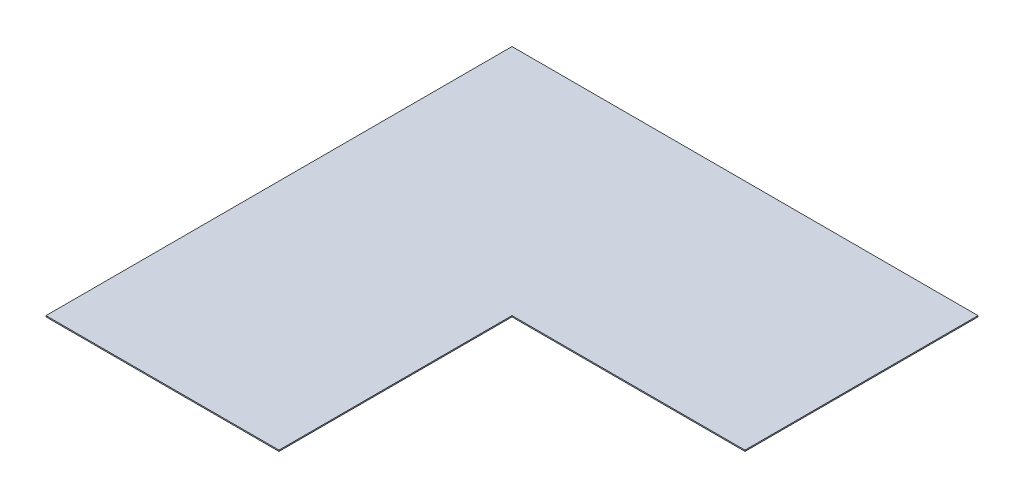
ISO-10303-21;
HEADER;
FILE_DESCRIPTION(('STEP AP214'),'2;1');
FILE_NAME('part.step','',(''),(''),'','','');
FILE_SCHEMA(('AUTOMOTIVE_DESIGN { 1 0 10303 214 1 1 1 1 }'));
ENDSEC;
DATA;
#1=APPLICATION_CONTEXT('core data for automotive mechanical design processes');
#2=APPLICATION_PROTOCOL_DEFINITION('international standard','automotive_design',2000,#1);
#3=PRODUCT_CONTEXT('',#1,'mechanical');
#4=PRODUCT('Part','Part','',(#3));
#5=PRODUCT_RELATED_PRODUCT_CATEGORY('part','',(#4));
#6=PRODUCT_DEFINITION_FORMATION('','',#4);
#7=PRODUCT_DEFINITION_CONTEXT('part definition',#1,'design');
#8=PRODUCT_DEFINITION('design','',#6,#7);
#9=PRODUCT_DEFINITION_SHAPE('','',#8);
#10=(LENGTH_UNIT() NAMED_UNIT(*) SI_UNIT(.MILLI.,.METRE.));
#11=(NAMED_UNIT(*) PLANE_ANGLE_UNIT() SI_UNIT($,.RADIAN.));
#12=(NAMED_UNIT(*) SI_UNIT($,.STERADIAN.) SOLID_ANGLE_UNIT());
#13=UNCERTAINTY_MEASURE_WITH_UNIT(LENGTH_MEASURE(1.E-05),#10,'distance_accuracy_value','');
#14=(GEOMETRIC_REPRESENTATION_CONTEXT(3) GLOBAL_UNCERTAINTY_ASSIGNED_CONTEXT((#13)) GLOBAL_UNIT_ASSIGNED_CONTEXT((#10,
#11,#12)) REPRESENTATION_CONTEXT('',''));
#15=CARTESIAN_POINT('',(0.,0.,0.));
#16=DIRECTION('',(0.,0.,1.));
#17=DIRECTION('',(1.,0.,0.));
#18=AXIS2_PLACEMENT_3D('',#15,#16,#17);
#19=CARTESIAN_POINT('',(5.77318429210511,2.601,3.25483545486299E-13));
#20=DIRECTION('',(1.,0.,0.));
#21=DIRECTION('',(0.,0.,-1.));
#22=AXIS2_PLACEMENT_3D('',#19,#20,#21);
#23=PLANE('',#22);
#24=DIRECTION('',(0.,0.,1.));
#25=VECTOR('',#24,1.);
#26=CARTESIAN_POINT('',(5.77318429210511,2.6,3.25483545486299E-13));
#27=LINE('',#26,#25);
#28=CARTESIAN_POINT('',(5.77318429210499,2.6,1.91907068929162));
#29=VERTEX_POINT('',#28);
#30=CARTESIAN_POINT('',(5.77318429210499,2.6,2.11907068929162));
#31=VERTEX_POINT('',#30);
#32=EDGE_CURVE('E11',#29,#31,#27,.T.);
#33=ORIENTED_EDGE('',*,*,#32,.F.);
#34=DIRECTION('',(0.,-1.,0.));
#35=VECTOR('',#34,1.);
#36=CARTESIAN_POINT('',(5.77318429210499,2.601,1.91907068929162));
#37=LINE('',#36,#35);
#38=CARTESIAN_POINT('',(5.77318429210499,2.601,1.91907068929162));
#39=VERTEX_POINT('',#38);
#40=EDGE_CURVE('E24',#39,#29,#37,.T.);
#41=ORIENTED_EDGE('',*,*,#40,.F.);
#42=DIRECTION('',(0.,0.,1.));
#43=VECTOR('',#42,1.);
#44=CARTESIAN_POINT('',(5.77318429210511,2.601,3.25483545486299E-13));
#45=LINE('',#44,#43);
#46=CARTESIAN_POINT('',(5.77318429210499,2.601,2.11907068929162));
#47=VERTEX_POINT('',#46);
#48=EDGE_CURVE('E116',#39,#47,#45,.T.);
#49=ORIENTED_EDGE('',*,*,#48,.T.);
#50=DIRECTION('',(0.,-1.,0.));
#51=VECTOR('',#50,1.);
#52=CARTESIAN_POINT('',(5.77318429210499,2.601,2.11907068929162));
#53=LINE('',#52,#51);
#54=EDGE_CURVE('E90',#47,#31,#53,.T.);
#55=ORIENTED_EDGE('',*,*,#54,.T.);
#56=EDGE_LOOP('',(#33,#41,#49,#55));
#57=FACE_BOUND('',#56,.T.);
#58=ADVANCED_FACE('F17',(#57),#23,.T.);
#59=CARTESIAN_POINT('',(0.,2.601,1.91907068929162));
#60=DIRECTION('',(0.,0.,-1.));
#61=DIRECTION('',(-1.,0.,0.));
#62=AXIS2_PLACEMENT_3D('',#59,#60,#61);
#63=PLANE('',#62);
#64=DIRECTION('',(1.,0.,0.));
#65=VECTOR('',#64,1.);
#66=CARTESIAN_POINT('',(0.,2.6,1.91907068929162));
#67=LINE('',#66,#65);
#68=CARTESIAN_POINT('',(5.37318429210568,2.6,1.91907068929162));
#69=VERTEX_POINT('',#68);
#70=EDGE_CURVE('E113',#69,#29,#67,.T.);
#71=ORIENTED_EDGE('',*,*,#70,.F.);
#72=DIRECTION('',(0.,-1.,0.));
#73=VECTOR('',#72,1.);
#74=CARTESIAN_POINT('',(5.37318429210568,2.601,1.91907068929162));
#75=LINE('',#74,#73);
#76=CARTESIAN_POINT('',(5.37318429210568,2.601,1.91907068929162));
#77=VERTEX_POINT('',#76);
#78=EDGE_CURVE('E110',#77,#69,#75,.T.);
#79=ORIENTED_EDGE('',*,*,#78,.F.);
#80=DIRECTION('',(1.,0.,0.));
#81=VECTOR('',#80,1.);
#82=CARTESIAN_POINT('',(0.,2.601,1.91907068929162));
#83=LINE('',#82,#81);
#84=EDGE_CURVE('E107',#77,#39,#83,.T.);
#85=ORIENTED_EDGE('',*,*,#84,.T.);
#86=ORIENTED_EDGE('',*,*,#40,.T.);
#87=EDGE_LOOP('',(#71,#79,#85,#86));
#88=FACE_BOUND('',#87,.T.);
#89=ADVANCED_FACE('F118',(#88),#63,.T.);
#90=CARTESIAN_POINT('',(5.37318429210568,2.601,0.));
#91=DIRECTION('',(1.,0.,0.));
#92=DIRECTION('',(0.,0.,-1.));
#93=AXIS2_PLACEMENT_3D('',#90,#91,#92);
#94=PLANE('',#93);
#95=DIRECTION('',(0.,0.,1.));
#96=VECTOR('',#95,1.);
#97=CARTESIAN_POINT('',(5.37318429210568,2.6,0.));
#98=LINE('',#97,#96);
#99=CARTESIAN_POINT('',(5.37318429210567,2.6,2.31907068929163));
#100=VERTEX_POINT('',#99);
#101=EDGE_CURVE('E105',#69,#100,#98,.T.);
#102=ORIENTED_EDGE('',*,*,#101,.T.);
#103=DIRECTION('',(0.,-1.,0.));
#104=VECTOR('',#103,1.);
#105=CARTESIAN_POINT('',(5.37318429210567,2.601,2.31907068929163));
#106=LINE('',#105,#104);
#107=CARTESIAN_POINT('',(5.37318429210567,2.601,2.31907068929163));
#108=VERTEX_POINT('',#107);
#109=EDGE_CURVE('E102',#108,#100,#106,.T.);
#110=ORIENTED_EDGE('',*,*,#109,.F.);
#111=DIRECTION('',(0.,0.,1.));
#112=VECTOR('',#111,1.);
#113=CARTESIAN_POINT('',(5.37318429210568,2.601,0.));
#114=LINE('',#113,#112);
#115=EDGE_CURVE('E100',#77,#108,#114,.T.);
#116=ORIENTED_EDGE('',*,*,#115,.F.);
#117=ORIENTED_EDGE('',*,*,#78,.T.);
#118=EDGE_LOOP('',(#102,#110,#116,#117));
#119=FACE_BOUND('',#118,.T.);
#120=ADVANCED_FACE('F124',(#119),#94,.F.);
#121=CARTESIAN_POINT('',(0.,2.601,2.31907068929163));
#122=DIRECTION('',(0.,0.,-1.));
#123=DIRECTION('',(-1.,0.,0.));
#124=AXIS2_PLACEMENT_3D('',#121,#122,#123);
#125=PLANE('',#124);
#126=DIRECTION('',(1.,0.,0.));
#127=VECTOR('',#126,1.);
#128=CARTESIAN_POINT('',(0.,2.6,2.31907068929163));
#129=LINE('',#128,#127);
#130=CARTESIAN_POINT('',(5.57318429210533,2.6,2.31907068929163));
#131=VERTEX_POINT('',#130);
#132=EDGE_CURVE('E98',#100,#131,#129,.T.);
#133=ORIENTED_EDGE('',*,*,#132,.T.);
#134=DIRECTION('',(0.,-1.,0.));
#135=VECTOR('',#134,1.);
#136=CARTESIAN_POINT('',(5.57318429210533,2.601,2.31907068929163));
#137=LINE('',#136,#135);
#138=CARTESIAN_POINT('',(5.57318429210533,2.601,2.31907068929163));
#139=VERTEX_POINT('',#138);
#140=EDGE_CURVE('E96',#139,#131,#137,.T.);
#141=ORIENTED_EDGE('',*,*,#140,.F.);
#142=DIRECTION('',(1.,0.,0.));
#143=VECTOR('',#142,1.);
#144=CARTESIAN_POINT('',(0.,2.601,2.31907068929163));
#145=LINE('',#144,#143);
#146=EDGE_CURVE('E85',#108,#139,#145,.T.);
#147=ORIENTED_EDGE('',*,*,#146,.F.);
#148=ORIENTED_EDGE('',*,*,#109,.T.);
#149=EDGE_LOOP('',(#133,#141,#147,#148));
#150=FACE_BOUND('',#149,.T.);
#151=ADVANCED_FACE('F127',(#150),#125,.F.);
#152=CARTESIAN_POINT('',(5.57318429210547,2.601,3.38377676961121E-13));
#153=DIRECTION('',(1.,0.,0.));
#154=DIRECTION('',(0.,0.,-1.));
#155=AXIS2_PLACEMENT_3D('',#152,#153,#154);
#156=PLANE('',#155);
#157=DIRECTION('',(0.,0.,1.));
#158=VECTOR('',#157,1.);
#159=CARTESIAN_POINT('',(5.57318429210547,2.6,3.38377676961121E-13));
#160=LINE('',#159,#158);
#161=CARTESIAN_POINT('',(5.57318429210533,2.6,2.11907068929162));
#162=VERTEX_POINT('',#161);
#163=EDGE_CURVE('E72',#162,#131,#160,.T.);
#164=ORIENTED_EDGE('',*,*,#163,.F.);
#165=DIRECTION('',(0.,-1.,0.));
#166=VECTOR('',#165,1.);
#167=CARTESIAN_POINT('',(5.57318429210533,2.601,2.11907068929162));
#168=LINE('',#167,#166);
#169=CARTESIAN_POINT('',(5.57318429210533,2.601,2.11907068929162));
#170=VERTEX_POINT('',#169);
#171=EDGE_CURVE('E66',#170,#162,#168,.T.);
#172=ORIENTED_EDGE('',*,*,#171,.F.);
#173=DIRECTION('',(0.,0.,1.));
#174=VECTOR('',#173,1.);
#175=CARTESIAN_POINT('',(5.57318429210547,2.601,3.38377676961121E-13));
#176=LINE('',#175,#174);
#177=EDGE_CURVE('E70',#170,#139,#176,.T.);
#178=ORIENTED_EDGE('',*,*,#177,.T.);
#179=ORIENTED_EDGE('',*,*,#140,.T.);
#180=EDGE_LOOP('',(#164,#172,#178,#179));
#181=FACE_BOUND('',#180,.T.);
#182=ADVANCED_FACE('F68',(#181),#156,.T.);
#183=CARTESIAN_POINT('',(0.,2.601,2.11907068929162));
#184=DIRECTION('',(0.,0.,-1.));
#185=DIRECTION('',(-1.,0.,0.));
#186=AXIS2_PLACEMENT_3D('',#183,#184,#185);
#187=PLANE('',#186);
#188=DIRECTION('',(1.,0.,0.));
#189=VECTOR('',#188,1.);
#190=CARTESIAN_POINT('',(0.,2.6,2.11907068929162));
#191=LINE('',#190,#189);
#192=EDGE_CURVE('E86',#162,#31,#191,.T.);
#193=ORIENTED_EDGE('',*,*,#192,.T.);
#194=ORIENTED_EDGE('',*,*,#54,.F.);
#195=DIRECTION('',(1.,0.,0.));
#196=VECTOR('',#195,1.);
#197=CARTESIAN_POINT('',(0.,2.601,2.11907068929162));
#198=LINE('',#197,#196);
#199=EDGE_CURVE('E82',#170,#47,#198,.T.);
#200=ORIENTED_EDGE('',*,*,#199,.F.);
#201=ORIENTED_EDGE('',*,*,#171,.T.);
#202=EDGE_LOOP('',(#193,#194,#200,#201));
#203=FACE_BOUND('',#202,.T.);
#204=ADVANCED_FACE('F89',(#203),#187,.F.);
#205=CARTESIAN_POINT('',(0.,2.601,0.));
#206=DIRECTION('',(0.,1.,0.));
#207=DIRECTION('',(0.,0.,1.));
#208=AXIS2_PLACEMENT_3D('',#205,#206,#207);
#209=PLANE('',#208);
#210=ORIENTED_EDGE('',*,*,#48,.F.);
#211=ORIENTED_EDGE('',*,*,#84,.F.);
#212=ORIENTED_EDGE('',*,*,#115,.T.);
#213=ORIENTED_EDGE('',*,*,#146,.T.);
#214=ORIENTED_EDGE('',*,*,#177,.F.);
#215=ORIENTED_EDGE('',*,*,#199,.T.);
#216=EDGE_LOOP('',(#210,#211,#212,#213,#214,#215));
#217=FACE_BOUND('',#216,.T.);
#218=ADVANCED_FACE('F81',(#217),#209,.T.);
#219=CARTESIAN_POINT('',(0.,2.6,0.));
#220=DIRECTION('',(0.,1.,0.));
#221=DIRECTION('',(0.,0.,1.));
#222=AXIS2_PLACEMENT_3D('',#219,#220,#221);
#223=PLANE('',#222);
#224=ORIENTED_EDGE('',*,*,#32,.T.);
#225=ORIENTED_EDGE('',*,*,#192,.F.);
#226=ORIENTED_EDGE('',*,*,#163,.T.);
#227=ORIENTED_EDGE('',*,*,#132,.F.);
#228=ORIENTED_EDGE('',*,*,#101,.F.);
#229=ORIENTED_EDGE('',*,*,#70,.T.);
#230=EDGE_LOOP('',(#224,#225,#226,#227,#228,#229));
#231=FACE_BOUND('',#230,.T.);
#232=ADVANCED_FACE('F121',(#231),#223,.F.);
#233=CLOSED_SHELL('',(#58,#89,#120,#151,#182,#204,#218,#232));
#234=MANIFOLD_SOLID_BREP('B1',#233);
#235=ADVANCED_BREP_SHAPE_REPRESENTATION('',(#18,#234),#14);
#236=SHAPE_DEFINITION_REPRESENTATION(#9,#235);
ENDSEC;
END-ISO-10303-21;
